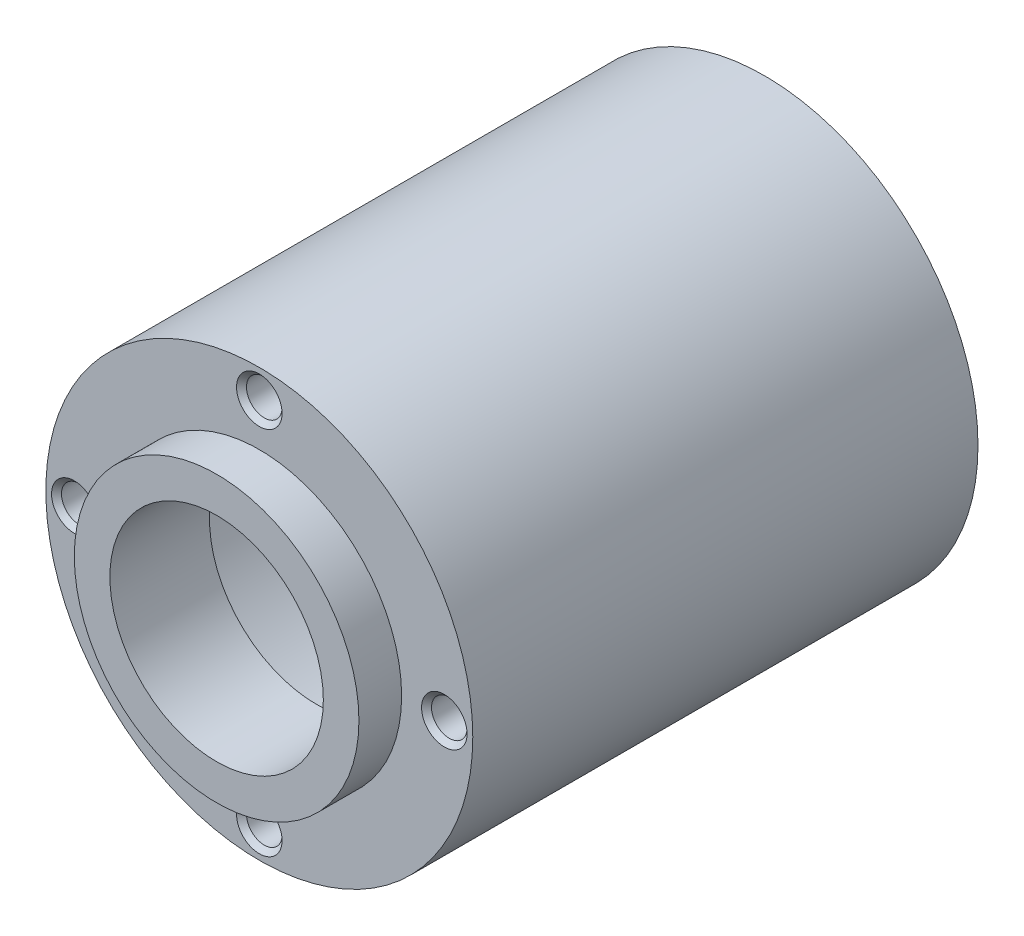
ISO-10303-21;
HEADER;
FILE_DESCRIPTION(('STEP AP214'),'2;1');
FILE_NAME('part.step','',(''),(''),'','','');
FILE_SCHEMA(('AUTOMOTIVE_DESIGN { 1 0 10303 214 1 1 1 1 }'));
ENDSEC;
DATA;
#1=APPLICATION_CONTEXT('core data for automotive mechanical design processes');
#2=APPLICATION_PROTOCOL_DEFINITION('international standard','automotive_design',2000,#1);
#3=PRODUCT_CONTEXT('',#1,'mechanical');
#4=PRODUCT('Part','Part','',(#3));
#5=PRODUCT_RELATED_PRODUCT_CATEGORY('part','',(#4));
#6=PRODUCT_DEFINITION_FORMATION('','',#4);
#7=PRODUCT_DEFINITION_CONTEXT('part definition',#1,'design');
#8=PRODUCT_DEFINITION('design','',#6,#7);
#9=PRODUCT_DEFINITION_SHAPE('','',#8);
#10=(LENGTH_UNIT() NAMED_UNIT(*) SI_UNIT(.MILLI.,.METRE.));
#11=(NAMED_UNIT(*) PLANE_ANGLE_UNIT() SI_UNIT($,.RADIAN.));
#12=(NAMED_UNIT(*) SI_UNIT($,.STERADIAN.) SOLID_ANGLE_UNIT());
#13=UNCERTAINTY_MEASURE_WITH_UNIT(LENGTH_MEASURE(1.E-05),#10,'distance_accuracy_value','');
#14=(GEOMETRIC_REPRESENTATION_CONTEXT(3) GLOBAL_UNCERTAINTY_ASSIGNED_CONTEXT((#13)) GLOBAL_UNIT_ASSIGNED_CONTEXT((#10,
#11,#12)) REPRESENTATION_CONTEXT('',''));
#15=CARTESIAN_POINT('',(0.,0.,0.));
#16=DIRECTION('',(0.,0.,1.));
#17=DIRECTION('',(1.,0.,0.));
#18=AXIS2_PLACEMENT_3D('',#15,#16,#17);
#19=CARTESIAN_POINT('',(0.,0.,0.));
#20=DIRECTION('',(0.,0.,1.));
#21=DIRECTION('',(1.,0.,0.));
#22=AXIS2_PLACEMENT_3D('',#19,#20,#21);
#23=PLANE('',#22);
#24=CARTESIAN_POINT('',(0.,0.,0.));
#25=DIRECTION('',(0.,0.,1.));
#26=DIRECTION('',(1.,0.,0.));
#27=AXIS2_PLACEMENT_3D('',#24,#25,#26);
#28=CIRCLE('',#27,15.);
#29=CARTESIAN_POINT('',(15.,0.,0.));
#30=VERTEX_POINT('',#29);
#31=EDGE_CURVE('E151',#30,#30,#28,.T.);
#32=ORIENTED_EDGE('',*,*,#31,.T.);
#33=EDGE_LOOP('',(#32));
#34=FACE_BOUND('',#33,.T.);
#35=CARTESIAN_POINT('',(13.,0.,0.));
#36=DIRECTION('',(0.,0.,1.));
#37=DIRECTION('',(1.,0.,0.));
#38=AXIS2_PLACEMENT_3D('',#35,#36,#37);
#39=CIRCLE('',#38,1.6);
#40=CARTESIAN_POINT('',(14.6,0.,0.));
#41=VERTEX_POINT('',#40);
#42=EDGE_CURVE('E208',#41,#41,#39,.T.);
#43=ORIENTED_EDGE('',*,*,#42,.F.);
#44=EDGE_LOOP('',(#43));
#45=FACE_BOUND('',#44,.T.);
#46=CARTESIAN_POINT('',(0.,13.,0.));
#47=DIRECTION('',(0.,0.,1.));
#48=DIRECTION('',(1.,0.,0.));
#49=AXIS2_PLACEMENT_3D('',#46,#47,#48);
#50=CIRCLE('',#49,1.6);
#51=CARTESIAN_POINT('',(1.59999999999995,13.,0.));
#52=VERTEX_POINT('',#51);
#53=EDGE_CURVE('E225',#52,#52,#50,.T.);
#54=ORIENTED_EDGE('',*,*,#53,.F.);
#55=EDGE_LOOP('',(#54));
#56=FACE_BOUND('',#55,.T.);
#57=CARTESIAN_POINT('',(-13.,0.,0.));
#58=DIRECTION('',(0.,0.,1.));
#59=DIRECTION('',(1.,0.,0.));
#60=AXIS2_PLACEMENT_3D('',#57,#58,#59);
#61=CIRCLE('',#60,1.6);
#62=CARTESIAN_POINT('',(-11.4,0.,0.));
#63=VERTEX_POINT('',#62);
#64=EDGE_CURVE('E237',#63,#63,#61,.T.);
#65=ORIENTED_EDGE('',*,*,#64,.F.);
#66=EDGE_LOOP('',(#65));
#67=FACE_BOUND('',#66,.T.);
#68=CARTESIAN_POINT('',(1.36167772214882E-13,-13.,0.));
#69=DIRECTION('',(0.,0.,1.));
#70=DIRECTION('',(1.,0.,0.));
#71=AXIS2_PLACEMENT_3D('',#68,#69,#70);
#72=CIRCLE('',#71,1.6);
#73=CARTESIAN_POINT('',(1.60000000000014,-13.,0.));
#74=VERTEX_POINT('',#73);
#75=EDGE_CURVE('E246',#74,#74,#72,.T.);
#76=ORIENTED_EDGE('',*,*,#75,.F.);
#77=EDGE_LOOP('',(#76));
#78=FACE_BOUND('',#77,.T.);
#79=CARTESIAN_POINT('',(0.,0.,0.));
#80=DIRECTION('',(0.,0.,1.));
#81=DIRECTION('',(1.,0.,0.));
#82=AXIS2_PLACEMENT_3D('',#79,#80,#81);
#83=CIRCLE('',#82,10.);
#84=CARTESIAN_POINT('',(10.,0.,0.));
#85=VERTEX_POINT('',#84);
#86=EDGE_CURVE('E251',#85,#85,#83,.T.);
#87=ORIENTED_EDGE('',*,*,#86,.F.);
#88=EDGE_LOOP('',(#87));
#89=FACE_BOUND('',#88,.T.);
#90=ADVANCED_FACE('F47',(#34,#45,#56,#67,#78,#89),#23,.T.);
#91=CARTESIAN_POINT('',(0.,0.,40.1636651713959));
#92=DIRECTION('',(0.,0.,-1.));
#93=DIRECTION('',(-1.,0.,0.));
#94=AXIS2_PLACEMENT_3D('',#91,#92,#93);
#95=CYLINDRICAL_SURFACE('',#94,14.2);
#96=DIRECTION('',(0.,0.,1.));
#97=VECTOR('',#96,1.);
#98=CARTESIAN_POINT('',(-0.365766993744531,-14.1952884615385,-17.925));
#99=LINE('',#98,#97);
#100=CARTESIAN_POINT('',(-0.365766993744501,-14.1952884615385,-35.5));
#101=VERTEX_POINT('',#100);
#102=CARTESIAN_POINT('',(-0.365766993744533,-14.1952884615385,-4.));
#103=VERTEX_POINT('',#102);
#104=EDGE_CURVE('E12',#101,#103,#99,.T.);
#105=ORIENTED_EDGE('',*,*,#104,.F.);
#106=CARTESIAN_POINT('',(0.,0.,-35.5));
#107=DIRECTION('',(0.,0.,1.));
#108=DIRECTION('',(1.,0.,0.));
#109=AXIS2_PLACEMENT_3D('',#106,#107,#108);
#110=CIRCLE('',#109,14.2);
#111=CARTESIAN_POINT('',(-14.1952884615385,-0.36576699374468,-35.5));
#112=VERTEX_POINT('',#111);
#113=EDGE_CURVE('E124',#112,#101,#110,.T.);
#114=ORIENTED_EDGE('',*,*,#113,.F.);
#115=DIRECTION('',(0.,0.,1.));
#116=VECTOR('',#115,1.);
#117=CARTESIAN_POINT('',(-14.1952884615385,-0.365766993744679,-17.925));
#118=LINE('',#117,#116);
#119=CARTESIAN_POINT('',(-14.1952884615385,-0.365766993744683,-4.));
#120=VERTEX_POINT('',#119);
#121=EDGE_CURVE('E176',#120,#112,#118,.F.);
#122=ORIENTED_EDGE('',*,*,#121,.F.);
#123=CARTESIAN_POINT('',(0.,0.,-4.));
#124=DIRECTION('',(0.,0.,1.));
#125=DIRECTION('',(1.,0.,0.));
#126=AXIS2_PLACEMENT_3D('',#123,#124,#125);
#127=CIRCLE('',#126,14.2);
#128=EDGE_CURVE('E126',#120,#103,#127,.T.);
#129=ORIENTED_EDGE('',*,*,#128,.T.);
#130=EDGE_LOOP('',(#105,#114,#122,#129));
#131=FACE_BOUND('',#130,.T.);
#132=ADVANCED_FACE('F123',(#131),#95,.F.);
#133=DIRECTION('',(0.,0.,1.));
#134=VECTOR('',#133,1.);
#135=CARTESIAN_POINT('',(-14.1952884615385,0.365766993744679,-17.925));
#136=LINE('',#135,#134);
#137=CARTESIAN_POINT('',(-14.1952884615385,0.365766993744651,-35.5));
#138=VERTEX_POINT('',#137);
#139=CARTESIAN_POINT('',(-14.1952884615385,0.365766993744682,-4.));
#140=VERTEX_POINT('',#139);
#141=EDGE_CURVE('E179',#138,#140,#136,.T.);
#142=ORIENTED_EDGE('',*,*,#141,.F.);
#143=CARTESIAN_POINT('',(-0.365766993744699,14.1952884615385,-35.5));
#144=VERTEX_POINT('',#143);
#145=EDGE_CURVE('E133',#144,#138,#110,.T.);
#146=ORIENTED_EDGE('',*,*,#145,.F.);
#147=DIRECTION('',(0.,0.,1.));
#148=VECTOR('',#147,1.);
#149=CARTESIAN_POINT('',(-0.365766993744729,14.1952884615385,-17.925));
#150=LINE('',#149,#148);
#151=CARTESIAN_POINT('',(-0.365766993744731,14.1952884615385,-4.));
#152=VERTEX_POINT('',#151);
#153=EDGE_CURVE('E170',#152,#144,#150,.F.);
#154=ORIENTED_EDGE('',*,*,#153,.F.);
#155=EDGE_CURVE('E152',#152,#140,#127,.T.);
#156=ORIENTED_EDGE('',*,*,#155,.T.);
#157=EDGE_LOOP('',(#142,#146,#154,#156));
#158=FACE_BOUND('',#157,.T.);
#159=ADVANCED_FACE('F284',(#158),#95,.F.);
#160=DIRECTION('',(0.,0.,1.));
#161=VECTOR('',#160,1.);
#162=CARTESIAN_POINT('',(0.365766993744631,14.1952884615385,-17.925));
#163=LINE('',#162,#161);
#164=CARTESIAN_POINT('',(0.3657669937446,14.1952884615385,-35.5));
#165=VERTEX_POINT('',#164);
#166=CARTESIAN_POINT('',(0.365766993744632,14.1952884615385,-4.));
#167=VERTEX_POINT('',#166);
#168=EDGE_CURVE('E173',#165,#167,#163,.T.);
#169=ORIENTED_EDGE('',*,*,#168,.F.);
#170=CARTESIAN_POINT('',(14.1952884615385,0.365766993744679,-35.5));
#171=VERTEX_POINT('',#170);
#172=EDGE_CURVE('E138',#171,#165,#110,.T.);
#173=ORIENTED_EDGE('',*,*,#172,.F.);
#174=DIRECTION('',(0.,0.,1.));
#175=VECTOR('',#174,1.);
#176=CARTESIAN_POINT('',(14.1952884615385,0.365766993744679,-17.925));
#177=LINE('',#176,#175);
#178=CARTESIAN_POINT('',(14.1952884615385,0.365766993744681,-4.));
#179=VERTEX_POINT('',#178);
#180=EDGE_CURVE('E157',#179,#171,#177,.F.);
#181=ORIENTED_EDGE('',*,*,#180,.F.);
#182=EDGE_CURVE('E147',#179,#167,#127,.T.);
#183=ORIENTED_EDGE('',*,*,#182,.T.);
#184=EDGE_LOOP('',(#169,#173,#181,#183));
#185=FACE_BOUND('',#184,.T.);
#186=ADVANCED_FACE('F294',(#185),#95,.F.);
#187=CARTESIAN_POINT('',(0.,0.,-35.5));
#188=DIRECTION('',(0.,0.,1.));
#189=DIRECTION('',(1.,0.,0.));
#190=AXIS2_PLACEMENT_3D('',#187,#188,#189);
#191=CYLINDRICAL_SURFACE('',#190,15.);
#192=CARTESIAN_POINT('',(0.,0.,-35.5));
#193=DIRECTION('',(0.,0.,1.));
#194=DIRECTION('',(1.,0.,0.));
#195=AXIS2_PLACEMENT_3D('',#192,#193,#194);
#196=CIRCLE('',#195,15.);
#197=CARTESIAN_POINT('',(15.,0.,-35.5));
#198=VERTEX_POINT('',#197);
#199=EDGE_CURVE('E153',#198,#198,#196,.T.);
#200=ORIENTED_EDGE('',*,*,#199,.T.);
#201=EDGE_LOOP('',(#200));
#202=FACE_BOUND('',#201,.T.);
#203=ORIENTED_EDGE('',*,*,#31,.F.);
#204=EDGE_LOOP('',(#203));
#205=FACE_BOUND('',#204,.T.);
#206=ADVANCED_FACE('F49',(#202,#205),#191,.T.);
#207=CARTESIAN_POINT('',(0.,0.,-35.5));
#208=DIRECTION('',(0.,0.,1.));
#209=DIRECTION('',(1.,0.,0.));
#210=AXIS2_PLACEMENT_3D('',#207,#208,#209);
#211=PLANE('',#210);
#212=ORIENTED_EDGE('',*,*,#113,.T.);
#213=CARTESIAN_POINT('',(1.36167772214882E-13,-13.,-35.5));
#214=DIRECTION('',(0.,0.,1.));
#215=DIRECTION('',(1.,0.,0.));
#216=AXIS2_PLACEMENT_3D('',#213,#214,#215);
#217=CIRCLE('',#216,1.24999999999999);
#218=CARTESIAN_POINT('',(0.365766993744798,-14.1952884615385,-35.5));
#219=VERTEX_POINT('',#218);
#220=EDGE_CURVE('E110',#101,#219,#217,.T.);
#221=ORIENTED_EDGE('',*,*,#220,.T.);
#222=CARTESIAN_POINT('',(14.1952884615385,-0.365766993744679,-35.5));
#223=VERTEX_POINT('',#222);
#224=EDGE_CURVE('E134',#219,#223,#110,.T.);
#225=ORIENTED_EDGE('',*,*,#224,.T.);
#226=CARTESIAN_POINT('',(13.,0.,-35.5));
#227=DIRECTION('',(0.,0.,1.));
#228=DIRECTION('',(1.,0.,0.));
#229=AXIS2_PLACEMENT_3D('',#226,#227,#228);
#230=CIRCLE('',#229,1.24999999999999);
#231=EDGE_CURVE('E198',#223,#171,#230,.T.);
#232=ORIENTED_EDGE('',*,*,#231,.T.);
#233=ORIENTED_EDGE('',*,*,#172,.T.);
#234=CARTESIAN_POINT('',(0.,13.,-35.5));
#235=DIRECTION('',(0.,0.,1.));
#236=DIRECTION('',(1.,0.,0.));
#237=AXIS2_PLACEMENT_3D('',#234,#235,#236);
#238=CIRCLE('',#237,1.24999999999999);
#239=EDGE_CURVE('E217',#165,#144,#238,.T.);
#240=ORIENTED_EDGE('',*,*,#239,.T.);
#241=ORIENTED_EDGE('',*,*,#145,.T.);
#242=CARTESIAN_POINT('',(-13.,0.,-35.5));
#243=DIRECTION('',(0.,0.,1.));
#244=DIRECTION('',(1.,0.,0.));
#245=AXIS2_PLACEMENT_3D('',#242,#243,#244);
#246=CIRCLE('',#245,1.24999999999999);
#247=EDGE_CURVE('E131',#138,#112,#246,.T.);
#248=ORIENTED_EDGE('',*,*,#247,.T.);
#249=EDGE_LOOP('',(#212,#221,#225,#232,#233,#240,#241,#248));
#250=FACE_BOUND('',#249,.T.);
#251=ORIENTED_EDGE('',*,*,#199,.F.);
#252=EDGE_LOOP('',(#251));
#253=FACE_BOUND('',#252,.T.);
#254=ADVANCED_FACE('F128',(#250,#253),#211,.F.);
#255=DIRECTION('',(0.,0.,1.));
#256=VECTOR('',#255,1.);
#257=CARTESIAN_POINT('',(0.365766993744829,-14.1952884615384,-17.925));
#258=LINE('',#257,#256);
#259=CARTESIAN_POINT('',(0.365766993744833,-14.1952884615385,-4.));
#260=VERTEX_POINT('',#259);
#261=EDGE_CURVE('E56',#260,#219,#258,.F.);
#262=ORIENTED_EDGE('',*,*,#261,.F.);
#263=CARTESIAN_POINT('',(14.1952884615385,-0.365766993744682,-4.));
#264=VERTEX_POINT('',#263);
#265=EDGE_CURVE('E144',#260,#264,#127,.T.);
#266=ORIENTED_EDGE('',*,*,#265,.T.);
#267=DIRECTION('',(0.,0.,1.));
#268=VECTOR('',#267,1.);
#269=CARTESIAN_POINT('',(14.1952884615385,-0.365766993744679,-17.925));
#270=LINE('',#269,#268);
#271=EDGE_CURVE('E166',#223,#264,#270,.T.);
#272=ORIENTED_EDGE('',*,*,#271,.F.);
#273=ORIENTED_EDGE('',*,*,#224,.F.);
#274=EDGE_LOOP('',(#262,#266,#272,#273));
#275=FACE_BOUND('',#274,.T.);
#276=ADVANCED_FACE('F189',(#275),#95,.F.);
#277=CARTESIAN_POINT('',(0.,0.,-4.));
#278=DIRECTION('',(0.,0.,1.));
#279=DIRECTION('',(1.,0.,0.));
#280=AXIS2_PLACEMENT_3D('',#277,#278,#279);
#281=PLANE('',#280);
#282=CARTESIAN_POINT('',(0.,0.,-4.));
#283=DIRECTION('',(0.,0.,1.));
#284=DIRECTION('',(1.,0.,0.));
#285=AXIS2_PLACEMENT_3D('',#282,#283,#284);
#286=CIRCLE('',#285,7.5);
#287=CARTESIAN_POINT('',(7.5,0.,-4.));
#288=VERTEX_POINT('',#287);
#289=EDGE_CURVE('E139',#288,#288,#286,.F.);
#290=ORIENTED_EDGE('',*,*,#289,.F.);
#291=EDGE_LOOP('',(#290));
#292=FACE_BOUND('',#291,.T.);
#293=ORIENTED_EDGE('',*,*,#265,.F.);
#294=CARTESIAN_POINT('',(1.36167772214882E-13,-13.,-4.));
#295=DIRECTION('',(0.,0.,1.));
#296=DIRECTION('',(1.,0.,0.));
#297=AXIS2_PLACEMENT_3D('',#294,#295,#296);
#298=CIRCLE('',#297,1.24999999999999);
#299=EDGE_CURVE('E62',#260,#103,#298,.T.);
#300=ORIENTED_EDGE('',*,*,#299,.T.);
#301=ORIENTED_EDGE('',*,*,#128,.F.);
#302=CARTESIAN_POINT('',(-13.,0.,-4.));
#303=DIRECTION('',(0.,0.,1.));
#304=DIRECTION('',(1.,0.,0.));
#305=AXIS2_PLACEMENT_3D('',#302,#303,#304);
#306=CIRCLE('',#305,1.24999999999999);
#307=EDGE_CURVE('E70',#120,#140,#306,.T.);
#308=ORIENTED_EDGE('',*,*,#307,.T.);
#309=ORIENTED_EDGE('',*,*,#155,.F.);
#310=CARTESIAN_POINT('',(0.,13.,-4.));
#311=DIRECTION('',(0.,0.,1.));
#312=DIRECTION('',(1.,0.,0.));
#313=AXIS2_PLACEMENT_3D('',#310,#311,#312);
#314=CIRCLE('',#313,1.24999999999999);
#315=EDGE_CURVE('E214',#152,#167,#314,.T.);
#316=ORIENTED_EDGE('',*,*,#315,.T.);
#317=ORIENTED_EDGE('',*,*,#182,.F.);
#318=CARTESIAN_POINT('',(13.,0.,-4.));
#319=DIRECTION('',(0.,0.,1.));
#320=DIRECTION('',(1.,0.,0.));
#321=AXIS2_PLACEMENT_3D('',#318,#319,#320);
#322=CIRCLE('',#321,1.24999999999999);
#323=EDGE_CURVE('E145',#179,#264,#322,.T.);
#324=ORIENTED_EDGE('',*,*,#323,.T.);
#325=EDGE_LOOP('',(#293,#300,#301,#308,#309,#316,#317,#324));
#326=FACE_BOUND('',#325,.T.);
#327=ADVANCED_FACE('F200',(#292,#326),#281,.F.);
#328=CARTESIAN_POINT('',(0.,0.,-35.5));
#329=DIRECTION('',(0.,0.,1.));
#330=DIRECTION('',(1.,0.,0.));
#331=AXIS2_PLACEMENT_3D('',#328,#329,#330);
#332=CYLINDRICAL_SURFACE('',#331,7.5);
#333=ORIENTED_EDGE('',*,*,#289,.T.);
#334=EDGE_LOOP('',(#333));
#335=FACE_BOUND('',#334,.T.);
#336=CARTESIAN_POINT('',(0.,0.,3.));
#337=DIRECTION('',(0.,0.,1.));
#338=DIRECTION('',(1.,0.,0.));
#339=AXIS2_PLACEMENT_3D('',#336,#337,#338);
#340=CIRCLE('',#339,7.5);
#341=CARTESIAN_POINT('',(7.5,0.,3.));
#342=VERTEX_POINT('',#341);
#343=EDGE_CURVE('E255',#342,#342,#340,.T.);
#344=ORIENTED_EDGE('',*,*,#343,.T.);
#345=EDGE_LOOP('',(#344));
#346=FACE_BOUND('',#345,.T.);
#347=ADVANCED_FACE('F263',(#335,#346),#332,.F.);
#348=CARTESIAN_POINT('',(13.,0.,0.));
#349=DIRECTION('',(0.,0.,1.));
#350=DIRECTION('',(1.,0.,0.));
#351=AXIS2_PLACEMENT_3D('',#348,#349,#350);
#352=CYLINDRICAL_SURFACE('',#351,1.24999999999999);
#353=ORIENTED_EDGE('',*,*,#271,.T.);
#354=ORIENTED_EDGE('',*,*,#323,.F.);
#355=ORIENTED_EDGE('',*,*,#180,.T.);
#356=ORIENTED_EDGE('',*,*,#231,.F.);
#357=EDGE_LOOP('',(#353,#354,#355,#356));
#358=FACE_BOUND('',#357,.T.);
#359=CARTESIAN_POINT('',(13.,0.,-0.350000000000003));
#360=DIRECTION('',(0.,0.,1.));
#361=DIRECTION('',(1.,0.,0.));
#362=AXIS2_PLACEMENT_3D('',#359,#360,#361);
#363=CIRCLE('',#362,1.25);
#364=CARTESIAN_POINT('',(14.25,0.,-0.350000000000003));
#365=VERTEX_POINT('',#364);
#366=EDGE_CURVE('E204',#365,#365,#363,.T.);
#367=ORIENTED_EDGE('',*,*,#366,.T.);
#368=EDGE_LOOP('',(#367));
#369=FACE_BOUND('',#368,.T.);
#370=ADVANCED_FACE('F194',(#358,#369),#352,.F.);
#371=CARTESIAN_POINT('',(13.,0.,0.));
#372=DIRECTION('',(0.,0.,1.));
#373=DIRECTION('',(1.,0.,0.));
#374=AXIS2_PLACEMENT_3D('',#371,#372,#373);
#375=CONICAL_SURFACE('',#374,1.6,0.785398163397451);
#376=ORIENTED_EDGE('',*,*,#366,.F.);
#377=EDGE_LOOP('',(#376));
#378=FACE_BOUND('',#377,.T.);
#379=ORIENTED_EDGE('',*,*,#42,.T.);
#380=EDGE_LOOP('',(#379));
#381=FACE_BOUND('',#380,.T.);
#382=ADVANCED_FACE('F300',(#378,#381),#375,.F.);
#383=CARTESIAN_POINT('',(0.,13.,0.));
#384=DIRECTION('',(0.,0.,1.));
#385=DIRECTION('',(1.,0.,0.));
#386=AXIS2_PLACEMENT_3D('',#383,#384,#385);
#387=CYLINDRICAL_SURFACE('',#386,1.24999999999999);
#388=ORIENTED_EDGE('',*,*,#168,.T.);
#389=ORIENTED_EDGE('',*,*,#315,.F.);
#390=ORIENTED_EDGE('',*,*,#153,.T.);
#391=ORIENTED_EDGE('',*,*,#239,.F.);
#392=EDGE_LOOP('',(#388,#389,#390,#391));
#393=FACE_BOUND('',#392,.T.);
#394=CARTESIAN_POINT('',(0.,13.,-0.350000000000003));
#395=DIRECTION('',(0.,0.,1.));
#396=DIRECTION('',(1.,0.,0.));
#397=AXIS2_PLACEMENT_3D('',#394,#395,#396);
#398=CIRCLE('',#397,1.25);
#399=CARTESIAN_POINT('',(1.24999999999995,13.,-0.350000000000003));
#400=VERTEX_POINT('',#399);
#401=EDGE_CURVE('E221',#400,#400,#398,.T.);
#402=ORIENTED_EDGE('',*,*,#401,.T.);
#403=EDGE_LOOP('',(#402));
#404=FACE_BOUND('',#403,.T.);
#405=ADVANCED_FACE('F303',(#393,#404),#387,.F.);
#406=CARTESIAN_POINT('',(0.,13.,0.));
#407=DIRECTION('',(0.,0.,1.));
#408=DIRECTION('',(1.,0.,0.));
#409=AXIS2_PLACEMENT_3D('',#406,#407,#408);
#410=CONICAL_SURFACE('',#409,1.6,0.785398163397449);
#411=ORIENTED_EDGE('',*,*,#401,.F.);
#412=EDGE_LOOP('',(#411));
#413=FACE_BOUND('',#412,.T.);
#414=ORIENTED_EDGE('',*,*,#53,.T.);
#415=EDGE_LOOP('',(#414));
#416=FACE_BOUND('',#415,.T.);
#417=ADVANCED_FACE('F307',(#413,#416),#410,.F.);
#418=CARTESIAN_POINT('',(-13.,0.,0.));
#419=DIRECTION('',(0.,0.,1.));
#420=DIRECTION('',(1.,0.,0.));
#421=AXIS2_PLACEMENT_3D('',#418,#419,#420);
#422=CYLINDRICAL_SURFACE('',#421,1.24999999999999);
#423=ORIENTED_EDGE('',*,*,#141,.T.);
#424=ORIENTED_EDGE('',*,*,#307,.F.);
#425=ORIENTED_EDGE('',*,*,#121,.T.);
#426=ORIENTED_EDGE('',*,*,#247,.F.);
#427=EDGE_LOOP('',(#423,#424,#425,#426));
#428=FACE_BOUND('',#427,.T.);
#429=CARTESIAN_POINT('',(-13.,0.,-0.350000000000003));
#430=DIRECTION('',(0.,0.,1.));
#431=DIRECTION('',(1.,0.,0.));
#432=AXIS2_PLACEMENT_3D('',#429,#430,#431);
#433=CIRCLE('',#432,1.25);
#434=CARTESIAN_POINT('',(-11.75,0.,-0.350000000000003));
#435=VERTEX_POINT('',#434);
#436=EDGE_CURVE('E233',#435,#435,#433,.T.);
#437=ORIENTED_EDGE('',*,*,#436,.T.);
#438=EDGE_LOOP('',(#437));
#439=FACE_BOUND('',#438,.T.);
#440=ADVANCED_FACE('F311',(#428,#439),#422,.F.);
#441=CARTESIAN_POINT('',(-13.,0.,0.));
#442=DIRECTION('',(0.,0.,1.));
#443=DIRECTION('',(1.,0.,0.));
#444=AXIS2_PLACEMENT_3D('',#441,#442,#443);
#445=CONICAL_SURFACE('',#444,1.6,0.785398163397451);
#446=ORIENTED_EDGE('',*,*,#436,.F.);
#447=EDGE_LOOP('',(#446));
#448=FACE_BOUND('',#447,.T.);
#449=ORIENTED_EDGE('',*,*,#64,.T.);
#450=EDGE_LOOP('',(#449));
#451=FACE_BOUND('',#450,.T.);
#452=ADVANCED_FACE('F315',(#448,#451),#445,.F.);
#453=CARTESIAN_POINT('',(1.36167772214882E-13,-13.,0.));
#454=DIRECTION('',(0.,0.,1.));
#455=DIRECTION('',(1.,0.,0.));
#456=AXIS2_PLACEMENT_3D('',#453,#454,#455);
#457=CYLINDRICAL_SURFACE('',#456,1.24999999999999);
#458=ORIENTED_EDGE('',*,*,#104,.T.);
#459=ORIENTED_EDGE('',*,*,#299,.F.);
#460=ORIENTED_EDGE('',*,*,#261,.T.);
#461=ORIENTED_EDGE('',*,*,#220,.F.);
#462=EDGE_LOOP('',(#458,#459,#460,#461));
#463=FACE_BOUND('',#462,.T.);
#464=CARTESIAN_POINT('',(1.36167772214882E-13,-13.,-0.350000000000003));
#465=DIRECTION('',(0.,0.,1.));
#466=DIRECTION('',(1.,0.,0.));
#467=AXIS2_PLACEMENT_3D('',#464,#465,#466);
#468=CIRCLE('',#467,1.25);
#469=CARTESIAN_POINT('',(1.25000000000013,-13.,-0.350000000000003));
#470=VERTEX_POINT('',#469);
#471=EDGE_CURVE('E118',#470,#470,#468,.T.);
#472=ORIENTED_EDGE('',*,*,#471,.T.);
#473=EDGE_LOOP('',(#472));
#474=FACE_BOUND('',#473,.T.);
#475=ADVANCED_FACE('F112',(#463,#474),#457,.F.);
#476=CARTESIAN_POINT('',(1.36167772214882E-13,-13.,0.));
#477=DIRECTION('',(0.,0.,1.));
#478=DIRECTION('',(1.,0.,0.));
#479=AXIS2_PLACEMENT_3D('',#476,#477,#478);
#480=CONICAL_SURFACE('',#479,1.6,0.785398163397449);
#481=ORIENTED_EDGE('',*,*,#471,.F.);
#482=EDGE_LOOP('',(#481));
#483=FACE_BOUND('',#482,.T.);
#484=ORIENTED_EDGE('',*,*,#75,.T.);
#485=EDGE_LOOP('',(#484));
#486=FACE_BOUND('',#485,.T.);
#487=ADVANCED_FACE('F268',(#483,#486),#480,.F.);
#488=CARTESIAN_POINT('',(0.,0.,3.));
#489=DIRECTION('',(0.,0.,1.));
#490=DIRECTION('',(1.,0.,0.));
#491=AXIS2_PLACEMENT_3D('',#488,#489,#490);
#492=PLANE('',#491);
#493=CARTESIAN_POINT('',(0.,0.,3.));
#494=DIRECTION('',(0.,0.,1.));
#495=DIRECTION('',(1.,0.,0.));
#496=AXIS2_PLACEMENT_3D('',#493,#494,#495);
#497=CIRCLE('',#496,10.);
#498=CARTESIAN_POINT('',(10.,0.,3.));
#499=VERTEX_POINT('',#498);
#500=EDGE_CURVE('E250',#499,#499,#497,.T.);
#501=ORIENTED_EDGE('',*,*,#500,.T.);
#502=EDGE_LOOP('',(#501));
#503=FACE_BOUND('',#502,.T.);
#504=ORIENTED_EDGE('',*,*,#343,.F.);
#505=EDGE_LOOP('',(#504));
#506=FACE_BOUND('',#505,.T.);
#507=ADVANCED_FACE('F265',(#503,#506),#492,.T.);
#508=CARTESIAN_POINT('',(0.,0.,3.));
#509=DIRECTION('',(0.,0.,-1.));
#510=DIRECTION('',(-1.,0.,0.));
#511=AXIS2_PLACEMENT_3D('',#508,#509,#510);
#512=CYLINDRICAL_SURFACE('',#511,10.);
#513=ORIENTED_EDGE('',*,*,#500,.F.);
#514=EDGE_LOOP('',(#513));
#515=FACE_BOUND('',#514,.T.);
#516=ORIENTED_EDGE('',*,*,#86,.T.);
#517=EDGE_LOOP('',(#516));
#518=FACE_BOUND('',#517,.T.);
#519=ADVANCED_FACE('F267',(#515,#518),#512,.T.);
#520=CLOSED_SHELL('',(#90,#132,#159,#186,#206,#254,#276,#327,#347,#370,#382,#405,#417,#440,#452,
#475,#487,#507,#519));
#521=MANIFOLD_SOLID_BREP('B2',#520);
#522=ADVANCED_BREP_SHAPE_REPRESENTATION('',(#18,#521),#14);
#523=SHAPE_DEFINITION_REPRESENTATION(#9,#522);
ENDSEC;
END-ISO-10303-21;
